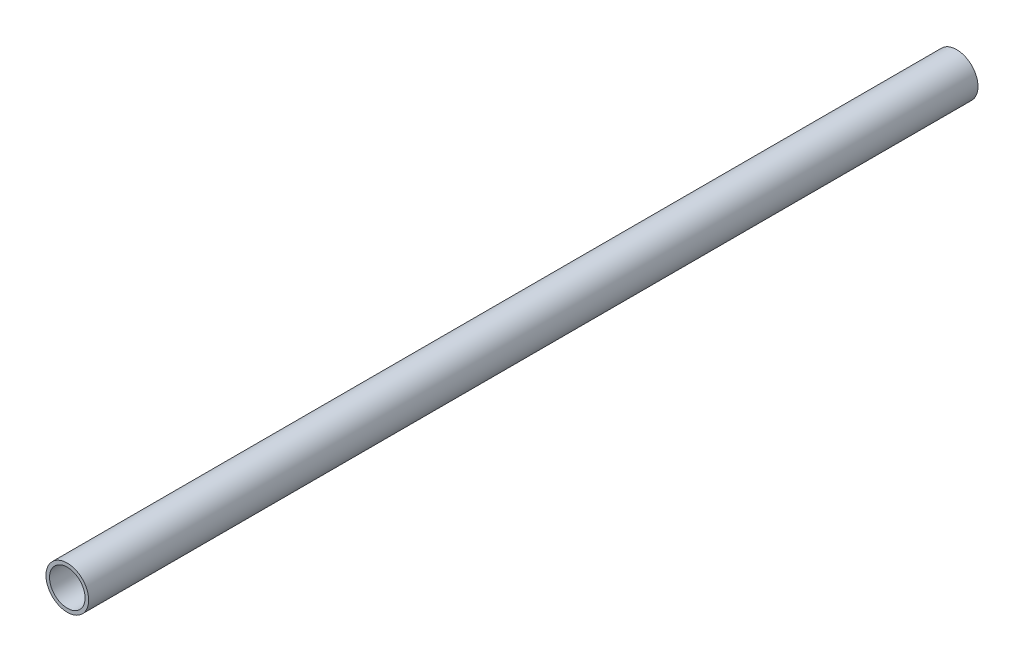
ISO-10303-21;
HEADER;
FILE_DESCRIPTION(('STEP AP214'),'2;1');
FILE_NAME('part.step','',(''),(''),'','','');
FILE_SCHEMA(('AUTOMOTIVE_DESIGN { 1 0 10303 214 1 1 1 1 }'));
ENDSEC;
DATA;
#1=APPLICATION_CONTEXT('core data for automotive mechanical design processes');
#2=APPLICATION_PROTOCOL_DEFINITION('international standard','automotive_design',2000,#1);
#3=PRODUCT_CONTEXT('',#1,'mechanical');
#4=PRODUCT('Part','Part','',(#3));
#5=PRODUCT_RELATED_PRODUCT_CATEGORY('part','',(#4));
#6=PRODUCT_DEFINITION_FORMATION('','',#4);
#7=PRODUCT_DEFINITION_CONTEXT('part definition',#1,'design');
#8=PRODUCT_DEFINITION('design','',#6,#7);
#9=PRODUCT_DEFINITION_SHAPE('','',#8);
#10=(LENGTH_UNIT() NAMED_UNIT(*) SI_UNIT(.MILLI.,.METRE.));
#11=(NAMED_UNIT(*) PLANE_ANGLE_UNIT() SI_UNIT($,.RADIAN.));
#12=(NAMED_UNIT(*) SI_UNIT($,.STERADIAN.) SOLID_ANGLE_UNIT());
#13=UNCERTAINTY_MEASURE_WITH_UNIT(LENGTH_MEASURE(1.E-05),#10,'distance_accuracy_value','');
#14=(GEOMETRIC_REPRESENTATION_CONTEXT(3) GLOBAL_UNCERTAINTY_ASSIGNED_CONTEXT((#13)) GLOBAL_UNIT_ASSIGNED_CONTEXT((#10,
#11,#12)) REPRESENTATION_CONTEXT('',''));
#15=CARTESIAN_POINT('',(0.,0.,0.));
#16=DIRECTION('',(0.,0.,1.));
#17=DIRECTION('',(1.,0.,0.));
#18=AXIS2_PLACEMENT_3D('',#15,#16,#17);
#19=CARTESIAN_POINT('',(0.,0.,250.));
#20=DIRECTION('',(0.,0.,1.));
#21=DIRECTION('',(1.,0.,0.));
#22=AXIS2_PLACEMENT_3D('',#19,#20,#21);
#23=PLANE('',#22);
#24=CARTESIAN_POINT('',(0.,0.,250.));
#25=DIRECTION('',(0.,0.,1.));
#26=DIRECTION('',(1.,0.,0.));
#27=AXIS2_PLACEMENT_3D('',#24,#25,#26);
#28=CIRCLE('',#27,6.);
#29=CARTESIAN_POINT('',(6.,0.,250.));
#30=VERTEX_POINT('',#29);
#31=EDGE_CURVE('E10',#30,#30,#28,.T.);
#32=ORIENTED_EDGE('',*,*,#31,.T.);
#33=EDGE_LOOP('',(#32));
#34=FACE_BOUND('',#33,.T.);
#35=CARTESIAN_POINT('',(0.,0.,250.));
#36=DIRECTION('',(0.,0.,1.));
#37=DIRECTION('',(1.,0.,0.));
#38=AXIS2_PLACEMENT_3D('',#35,#36,#37);
#39=CIRCLE('',#38,5.);
#40=CARTESIAN_POINT('',(5.,0.,250.));
#41=VERTEX_POINT('',#40);
#42=EDGE_CURVE('E41',#41,#41,#39,.T.);
#43=ORIENTED_EDGE('',*,*,#42,.F.);
#44=EDGE_LOOP('',(#43));
#45=FACE_BOUND('',#44,.T.);
#46=ADVANCED_FACE('F30',(#34,#45),#23,.T.);
#47=CARTESIAN_POINT('',(0.,0.,0.));
#48=DIRECTION('',(0.,0.,1.));
#49=DIRECTION('',(1.,0.,0.));
#50=AXIS2_PLACEMENT_3D('',#47,#48,#49);
#51=PLANE('',#50);
#52=CARTESIAN_POINT('',(0.,0.,0.));
#53=DIRECTION('',(0.,0.,1.));
#54=DIRECTION('',(1.,0.,0.));
#55=AXIS2_PLACEMENT_3D('',#52,#53,#54);
#56=CIRCLE('',#55,6.);
#57=CARTESIAN_POINT('',(6.,0.,0.));
#58=VERTEX_POINT('',#57);
#59=EDGE_CURVE('E34',#58,#58,#56,.T.);
#60=ORIENTED_EDGE('',*,*,#59,.F.);
#61=EDGE_LOOP('',(#60));
#62=FACE_BOUND('',#61,.T.);
#63=CARTESIAN_POINT('',(0.,0.,0.));
#64=DIRECTION('',(0.,0.,1.));
#65=DIRECTION('',(1.,0.,0.));
#66=AXIS2_PLACEMENT_3D('',#63,#64,#65);
#67=CIRCLE('',#66,5.);
#68=CARTESIAN_POINT('',(5.,0.,0.));
#69=VERTEX_POINT('',#68);
#70=EDGE_CURVE('E43',#69,#69,#67,.T.);
#71=ORIENTED_EDGE('',*,*,#70,.T.);
#72=EDGE_LOOP('',(#71));
#73=FACE_BOUND('',#72,.T.);
#74=ADVANCED_FACE('F53',(#62,#73),#51,.F.);
#75=CARTESIAN_POINT('',(0.,0.,250.));
#76=DIRECTION('',(0.,0.,-1.));
#77=DIRECTION('',(-1.,0.,0.));
#78=AXIS2_PLACEMENT_3D('',#75,#76,#77);
#79=CYLINDRICAL_SURFACE('',#78,6.);
#80=ORIENTED_EDGE('',*,*,#31,.F.);
#81=EDGE_LOOP('',(#80));
#82=FACE_BOUND('',#81,.T.);
#83=ORIENTED_EDGE('',*,*,#59,.T.);
#84=EDGE_LOOP('',(#83));
#85=FACE_BOUND('',#84,.T.);
#86=ADVANCED_FACE('F32',(#82,#85),#79,.T.);
#87=CARTESIAN_POINT('',(0.,0.,250.));
#88=DIRECTION('',(0.,0.,-1.));
#89=DIRECTION('',(-1.,0.,0.));
#90=AXIS2_PLACEMENT_3D('',#87,#88,#89);
#91=CYLINDRICAL_SURFACE('',#90,5.);
#92=ORIENTED_EDGE('',*,*,#42,.T.);
#93=EDGE_LOOP('',(#92));
#94=FACE_BOUND('',#93,.T.);
#95=ORIENTED_EDGE('',*,*,#70,.F.);
#96=EDGE_LOOP('',(#95));
#97=FACE_BOUND('',#96,.T.);
#98=ADVANCED_FACE('F49',(#94,#97),#91,.F.);
#99=CLOSED_SHELL('',(#46,#74,#86,#98));
#100=MANIFOLD_SOLID_BREP('B2',#99);
#101=ADVANCED_BREP_SHAPE_REPRESENTATION('',(#18,#100),#14);
#102=SHAPE_DEFINITION_REPRESENTATION(#9,#101);
ENDSEC;
END-ISO-10303-21;
